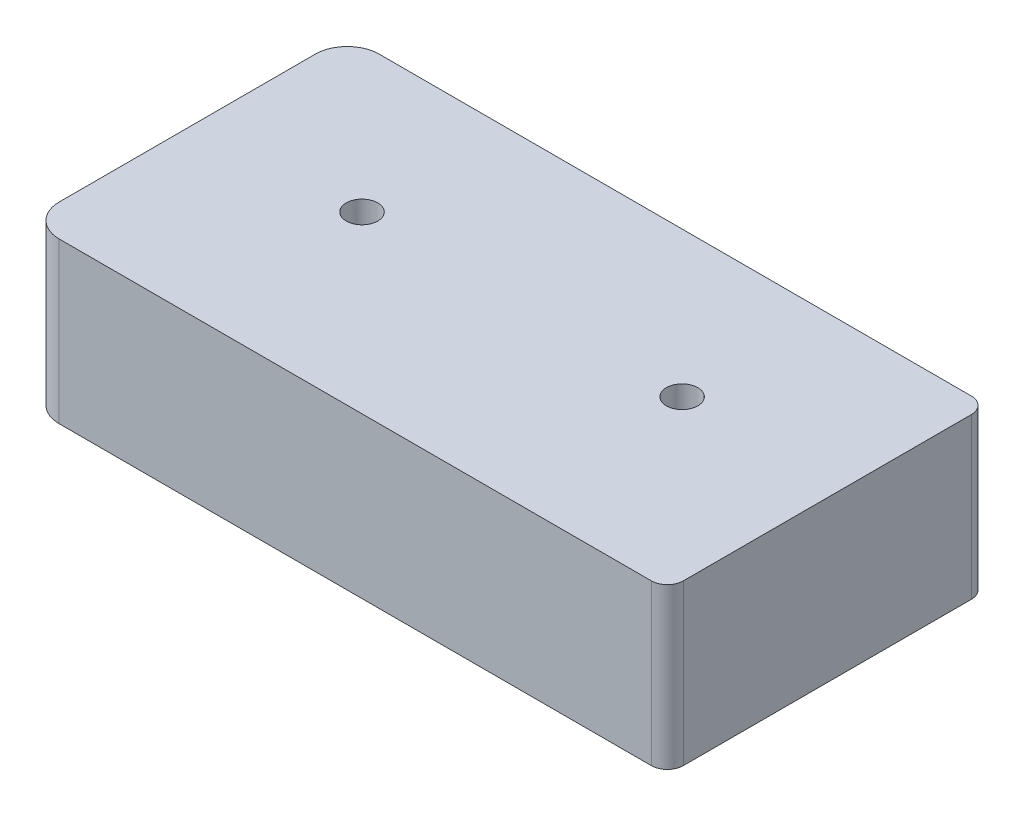
ISO-10303-21;
HEADER;
FILE_DESCRIPTION(('STEP AP214'),'2;1');
FILE_NAME('part.step','',(''),(''),'','','');
FILE_SCHEMA(('AUTOMOTIVE_DESIGN { 1 0 10303 214 1 1 1 1 }'));
ENDSEC;
DATA;
#1=APPLICATION_CONTEXT('core data for automotive mechanical design processes');
#2=APPLICATION_PROTOCOL_DEFINITION('international standard','automotive_design',2000,#1);
#3=PRODUCT_CONTEXT('',#1,'mechanical');
#4=PRODUCT('Part','Part','',(#3));
#5=PRODUCT_RELATED_PRODUCT_CATEGORY('part','',(#4));
#6=PRODUCT_DEFINITION_FORMATION('','',#4);
#7=PRODUCT_DEFINITION_CONTEXT('part definition',#1,'design');
#8=PRODUCT_DEFINITION('design','',#6,#7);
#9=PRODUCT_DEFINITION_SHAPE('','',#8);
#10=(LENGTH_UNIT() NAMED_UNIT(*) SI_UNIT(.MILLI.,.METRE.));
#11=(NAMED_UNIT(*) PLANE_ANGLE_UNIT() SI_UNIT($,.RADIAN.));
#12=(NAMED_UNIT(*) SI_UNIT($,.STERADIAN.) SOLID_ANGLE_UNIT());
#13=UNCERTAINTY_MEASURE_WITH_UNIT(LENGTH_MEASURE(1.E-05),#10,'distance_accuracy_value','');
#14=(GEOMETRIC_REPRESENTATION_CONTEXT(3) GLOBAL_UNCERTAINTY_ASSIGNED_CONTEXT((#13)) GLOBAL_UNIT_ASSIGNED_CONTEXT((#10,
#11,#12)) REPRESENTATION_CONTEXT('',''));
#15=CARTESIAN_POINT('',(0.,0.,0.));
#16=DIRECTION('',(0.,0.,1.));
#17=DIRECTION('',(1.,0.,0.));
#18=AXIS2_PLACEMENT_3D('',#15,#16,#17);
#19=CARTESIAN_POINT('',(-50.8,25.4,-23.0572815533981));
#20=DIRECTION('',(1.,0.,0.));
#21=DIRECTION('',(0.,0.,-1.));
#22=AXIS2_PLACEMENT_3D('',#19,#20,#21);
#23=PLANE('',#22);
#24=DIRECTION('',(0.,0.,1.));
#25=VECTOR('',#24,1.);
#26=CARTESIAN_POINT('',(-50.8,0.,-23.0572815533981));
#27=LINE('',#26,#25);
#28=CARTESIAN_POINT('',(-50.8,0.,-17.9772815533981));
#29=VERTEX_POINT('',#28);
#30=CARTESIAN_POINT('',(-50.8,0.,22.6627184466019));
#31=VERTEX_POINT('',#30);
#32=EDGE_CURVE('E138',#29,#31,#27,.T.);
#33=ORIENTED_EDGE('',*,*,#32,.T.);
#34=DIRECTION('',(0.,-1.,0.));
#35=VECTOR('',#34,1.);
#36=CARTESIAN_POINT('',(-50.8,25.4,22.6627184466019));
#37=LINE('',#36,#35);
#38=CARTESIAN_POINT('',(-50.8,25.4,22.6627184466019));
#39=VERTEX_POINT('',#38);
#40=EDGE_CURVE('E121',#31,#39,#37,.F.);
#41=ORIENTED_EDGE('',*,*,#40,.T.);
#42=DIRECTION('',(0.,0.,1.));
#43=VECTOR('',#42,1.);
#44=CARTESIAN_POINT('',(-50.8,25.4,-23.0572815533981));
#45=LINE('',#44,#43);
#46=CARTESIAN_POINT('',(-50.8,25.4,-17.9772815533981));
#47=VERTEX_POINT('',#46);
#48=EDGE_CURVE('E147',#47,#39,#45,.T.);
#49=ORIENTED_EDGE('',*,*,#48,.F.);
#50=DIRECTION('',(0.,-1.,0.));
#51=VECTOR('',#50,1.);
#52=CARTESIAN_POINT('',(-50.8,25.4,-17.9772815533981));
#53=LINE('',#52,#51);
#54=EDGE_CURVE('E126',#47,#29,#53,.T.);
#55=ORIENTED_EDGE('',*,*,#54,.T.);
#56=EDGE_LOOP('',(#33,#41,#49,#55));
#57=FACE_BOUND('',#56,.T.);
#58=ADVANCED_FACE('F48',(#57),#23,.F.);
#59=CARTESIAN_POINT('',(-50.8,25.4,27.7427184466019));
#60=DIRECTION('',(0.,0.,-1.));
#61=DIRECTION('',(-1.,0.,0.));
#62=AXIS2_PLACEMENT_3D('',#59,#60,#61);
#63=PLANE('',#62);
#64=DIRECTION('',(1.,0.,0.));
#65=VECTOR('',#64,1.);
#66=CARTESIAN_POINT('',(-50.8,0.,27.7427184466019));
#67=LINE('',#66,#65);
#68=CARTESIAN_POINT('',(-45.72,0.,27.7427184466019));
#69=VERTEX_POINT('',#68);
#70=CARTESIAN_POINT('',(48.26,0.,27.7427184466019));
#71=VERTEX_POINT('',#70);
#72=EDGE_CURVE('E130',#69,#71,#67,.T.);
#73=ORIENTED_EDGE('',*,*,#72,.T.);
#74=DIRECTION('',(0.,-1.,0.));
#75=VECTOR('',#74,1.);
#76=CARTESIAN_POINT('',(48.26,25.4,27.7427184466019));
#77=LINE('',#76,#75);
#78=CARTESIAN_POINT('',(48.26,25.4,27.7427184466019));
#79=VERTEX_POINT('',#78);
#80=EDGE_CURVE('E71',#71,#79,#77,.F.);
#81=ORIENTED_EDGE('',*,*,#80,.T.);
#82=DIRECTION('',(1.,0.,0.));
#83=VECTOR('',#82,1.);
#84=CARTESIAN_POINT('',(-50.8,25.4,27.7427184466019));
#85=LINE('',#84,#83);
#86=CARTESIAN_POINT('',(-45.72,25.4,27.7427184466019));
#87=VERTEX_POINT('',#86);
#88=EDGE_CURVE('E131',#87,#79,#85,.T.);
#89=ORIENTED_EDGE('',*,*,#88,.F.);
#90=DIRECTION('',(0.,-1.,0.));
#91=VECTOR('',#90,1.);
#92=CARTESIAN_POINT('',(-45.72,25.4,27.7427184466019));
#93=LINE('',#92,#91);
#94=EDGE_CURVE('E120',#87,#69,#93,.T.);
#95=ORIENTED_EDGE('',*,*,#94,.T.);
#96=EDGE_LOOP('',(#73,#81,#89,#95));
#97=FACE_BOUND('',#96,.T.);
#98=ADVANCED_FACE('F129',(#97),#63,.F.);
#99=CARTESIAN_POINT('',(50.8,25.4,-23.0572815533981));
#100=DIRECTION('',(-1.,0.,0.));
#101=DIRECTION('',(0.,0.,1.));
#102=AXIS2_PLACEMENT_3D('',#99,#100,#101);
#103=PLANE('',#102);
#104=DIRECTION('',(0.,0.,-1.));
#105=VECTOR('',#104,1.);
#106=CARTESIAN_POINT('',(50.8,25.4,-23.0572815533981));
#107=LINE('',#106,#105);
#108=CARTESIAN_POINT('',(50.8,25.4,25.2027184466019));
#109=VERTEX_POINT('',#108);
#110=CARTESIAN_POINT('',(50.8,25.4,-20.5172815533981));
#111=VERTEX_POINT('',#110);
#112=EDGE_CURVE('E173',#109,#111,#107,.T.);
#113=ORIENTED_EDGE('',*,*,#112,.F.);
#114=DIRECTION('',(0.,-1.,0.));
#115=VECTOR('',#114,1.);
#116=CARTESIAN_POINT('',(50.8,25.4,25.2027184466019));
#117=LINE('',#116,#115);
#118=CARTESIAN_POINT('',(50.8,0.,25.2027184466019));
#119=VERTEX_POINT('',#118);
#120=EDGE_CURVE('E163',#109,#119,#117,.T.);
#121=ORIENTED_EDGE('',*,*,#120,.T.);
#122=DIRECTION('',(0.,0.,-1.));
#123=VECTOR('',#122,1.);
#124=CARTESIAN_POINT('',(50.8,0.,-23.0572815533981));
#125=LINE('',#124,#123);
#126=CARTESIAN_POINT('',(50.8,0.,-20.5172815533981));
#127=VERTEX_POINT('',#126);
#128=EDGE_CURVE('E137',#119,#127,#125,.T.);
#129=ORIENTED_EDGE('',*,*,#128,.T.);
#130=DIRECTION('',(0.,-1.,0.));
#131=VECTOR('',#130,1.);
#132=CARTESIAN_POINT('',(50.8,25.4,-20.5172815533981));
#133=LINE('',#132,#131);
#134=EDGE_CURVE('E161',#127,#111,#133,.F.);
#135=ORIENTED_EDGE('',*,*,#134,.T.);
#136=EDGE_LOOP('',(#113,#121,#129,#135));
#137=FACE_BOUND('',#136,.T.);
#138=ADVANCED_FACE('F177',(#137),#103,.F.);
#139=CARTESIAN_POINT('',(-50.8,25.4,-23.0572815533981));
#140=DIRECTION('',(0.,0.,1.));
#141=DIRECTION('',(1.,0.,0.));
#142=AXIS2_PLACEMENT_3D('',#139,#140,#141);
#143=PLANE('',#142);
#144=DIRECTION('',(-1.,0.,0.));
#145=VECTOR('',#144,1.);
#146=CARTESIAN_POINT('',(-50.8,25.4,-23.0572815533981));
#147=LINE('',#146,#145);
#148=CARTESIAN_POINT('',(48.26,25.4,-23.0572815533981));
#149=VERTEX_POINT('',#148);
#150=CARTESIAN_POINT('',(-45.72,25.4,-23.0572815533981));
#151=VERTEX_POINT('',#150);
#152=EDGE_CURVE('E132',#149,#151,#147,.T.);
#153=ORIENTED_EDGE('',*,*,#152,.F.);
#154=DIRECTION('',(0.,-1.,0.));
#155=VECTOR('',#154,1.);
#156=CARTESIAN_POINT('',(48.26,25.4,-23.0572815533981));
#157=LINE('',#156,#155);
#158=CARTESIAN_POINT('',(48.26,0.,-23.0572815533981));
#159=VERTEX_POINT('',#158);
#160=EDGE_CURVE('E13',#149,#159,#157,.T.);
#161=ORIENTED_EDGE('',*,*,#160,.T.);
#162=DIRECTION('',(-1.,0.,0.));
#163=VECTOR('',#162,1.);
#164=CARTESIAN_POINT('',(-50.8,0.,-23.0572815533981));
#165=LINE('',#164,#163);
#166=CARTESIAN_POINT('',(-45.72,0.,-23.0572815533981));
#167=VERTEX_POINT('',#166);
#168=EDGE_CURVE('E141',#159,#167,#165,.T.);
#169=ORIENTED_EDGE('',*,*,#168,.T.);
#170=DIRECTION('',(0.,-1.,0.));
#171=VECTOR('',#170,1.);
#172=CARTESIAN_POINT('',(-45.72,25.4,-23.0572815533981));
#173=LINE('',#172,#171);
#174=EDGE_CURVE('E158',#167,#151,#173,.F.);
#175=ORIENTED_EDGE('',*,*,#174,.T.);
#176=EDGE_LOOP('',(#153,#161,#169,#175));
#177=FACE_BOUND('',#176,.T.);
#178=ADVANCED_FACE('F209',(#177),#143,.F.);
#179=CARTESIAN_POINT('',(0.,25.4,0.));
#180=DIRECTION('',(0.,1.,0.));
#181=DIRECTION('',(0.,0.,1.));
#182=AXIS2_PLACEMENT_3D('',#179,#180,#181);
#183=PLANE('',#182);
#184=CARTESIAN_POINT('',(-25.4,25.4,0.));
#185=DIRECTION('',(0.,1.,0.));
#186=DIRECTION('',(0.,0.,1.));
#187=AXIS2_PLACEMENT_3D('',#184,#185,#186);
#188=CIRCLE('',#187,2.5);
#189=CARTESIAN_POINT('',(-25.4,25.4,2.5));
#190=VERTEX_POINT('',#189);
#191=EDGE_CURVE('E265',#190,#190,#188,.T.);
#192=ORIENTED_EDGE('',*,*,#191,.F.);
#193=EDGE_LOOP('',(#192));
#194=FACE_BOUND('',#193,.T.);
#195=CARTESIAN_POINT('',(25.4,25.4,0.));
#196=DIRECTION('',(0.,1.,0.));
#197=DIRECTION('',(0.,0.,1.));
#198=AXIS2_PLACEMENT_3D('',#195,#196,#197);
#199=CIRCLE('',#198,2.5);
#200=CARTESIAN_POINT('',(25.4,25.4,2.5));
#201=VERTEX_POINT('',#200);
#202=EDGE_CURVE('E270',#201,#201,#199,.T.);
#203=ORIENTED_EDGE('',*,*,#202,.F.);
#204=EDGE_LOOP('',(#203));
#205=FACE_BOUND('',#204,.T.);
#206=ORIENTED_EDGE('',*,*,#88,.T.);
#207=CARTESIAN_POINT('',(48.26,25.4,25.2027184466019));
#208=DIRECTION('',(0.,1.,0.));
#209=DIRECTION('',(0.,0.,1.));
#210=AXIS2_PLACEMENT_3D('',#207,#208,#209);
#211=CIRCLE('',#210,2.54);
#212=EDGE_CURVE('E56',#79,#109,#211,.T.);
#213=ORIENTED_EDGE('',*,*,#212,.T.);
#214=ORIENTED_EDGE('',*,*,#112,.T.);
#215=CARTESIAN_POINT('',(48.26,25.4,-20.5172815533981));
#216=DIRECTION('',(0.,1.,0.));
#217=DIRECTION('',(0.,0.,1.));
#218=AXIS2_PLACEMENT_3D('',#215,#216,#217);
#219=CIRCLE('',#218,2.54);
#220=EDGE_CURVE('E63',#111,#149,#219,.T.);
#221=ORIENTED_EDGE('',*,*,#220,.T.);
#222=ORIENTED_EDGE('',*,*,#152,.T.);
#223=CARTESIAN_POINT('',(-45.72,25.4,-17.9772815533981));
#224=DIRECTION('',(0.,1.,0.));
#225=DIRECTION('',(0.,0.,1.));
#226=AXIS2_PLACEMENT_3D('',#223,#224,#225);
#227=CIRCLE('',#226,5.08);
#228=EDGE_CURVE('E154',#151,#47,#227,.T.);
#229=ORIENTED_EDGE('',*,*,#228,.T.);
#230=ORIENTED_EDGE('',*,*,#48,.T.);
#231=CARTESIAN_POINT('',(-45.72,25.4,22.6627184466019));
#232=DIRECTION('',(0.,1.,0.));
#233=DIRECTION('',(0.,0.,1.));
#234=AXIS2_PLACEMENT_3D('',#231,#232,#233);
#235=CIRCLE('',#234,5.08);
#236=EDGE_CURVE('E156',#39,#87,#235,.T.);
#237=ORIENTED_EDGE('',*,*,#236,.T.);
#238=EDGE_LOOP('',(#206,#213,#214,#221,#222,#229,#230,#237));
#239=FACE_BOUND('',#238,.T.);
#240=ADVANCED_FACE('F172',(#194,#205,#239),#183,.T.);
#241=CARTESIAN_POINT('',(0.,0.,0.));
#242=DIRECTION('',(0.,1.,0.));
#243=DIRECTION('',(0.,0.,1.));
#244=AXIS2_PLACEMENT_3D('',#241,#242,#243);
#245=PLANE('',#244);
#246=CARTESIAN_POINT('',(-25.4,0.,0.));
#247=DIRECTION('',(0.,1.,0.));
#248=DIRECTION('',(0.,0.,1.));
#249=AXIS2_PLACEMENT_3D('',#246,#247,#248);
#250=CIRCLE('',#249,2.5);
#251=CARTESIAN_POINT('',(-25.4,0.,2.5));
#252=VERTEX_POINT('',#251);
#253=EDGE_CURVE('E143',#252,#252,#250,.T.);
#254=ORIENTED_EDGE('',*,*,#253,.T.);
#255=EDGE_LOOP('',(#254));
#256=FACE_BOUND('',#255,.T.);
#257=CARTESIAN_POINT('',(25.4,0.,0.));
#258=DIRECTION('',(0.,1.,0.));
#259=DIRECTION('',(0.,0.,1.));
#260=AXIS2_PLACEMENT_3D('',#257,#258,#259);
#261=CIRCLE('',#260,2.5);
#262=CARTESIAN_POINT('',(25.4,0.,2.5));
#263=VERTEX_POINT('',#262);
#264=EDGE_CURVE('E266',#263,#263,#261,.T.);
#265=ORIENTED_EDGE('',*,*,#264,.T.);
#266=EDGE_LOOP('',(#265));
#267=FACE_BOUND('',#266,.T.);
#268=ORIENTED_EDGE('',*,*,#128,.F.);
#269=CARTESIAN_POINT('',(48.26,0.,25.2027184466019));
#270=DIRECTION('',(0.,1.,0.));
#271=DIRECTION('',(0.,0.,1.));
#272=AXIS2_PLACEMENT_3D('',#269,#270,#271);
#273=CIRCLE('',#272,2.54);
#274=EDGE_CURVE('E136',#119,#71,#273,.F.);
#275=ORIENTED_EDGE('',*,*,#274,.T.);
#276=ORIENTED_EDGE('',*,*,#72,.F.);
#277=CARTESIAN_POINT('',(-45.72,0.,22.6627184466019));
#278=DIRECTION('',(0.,1.,0.));
#279=DIRECTION('',(0.,0.,1.));
#280=AXIS2_PLACEMENT_3D('',#277,#278,#279);
#281=CIRCLE('',#280,5.08);
#282=EDGE_CURVE('E116',#69,#31,#281,.F.);
#283=ORIENTED_EDGE('',*,*,#282,.T.);
#284=ORIENTED_EDGE('',*,*,#32,.F.);
#285=CARTESIAN_POINT('',(-45.72,0.,-17.9772815533981));
#286=DIRECTION('',(0.,1.,0.));
#287=DIRECTION('',(0.,0.,1.));
#288=AXIS2_PLACEMENT_3D('',#285,#286,#287);
#289=CIRCLE('',#288,5.08);
#290=EDGE_CURVE('E127',#29,#167,#289,.F.);
#291=ORIENTED_EDGE('',*,*,#290,.T.);
#292=ORIENTED_EDGE('',*,*,#168,.F.);
#293=CARTESIAN_POINT('',(48.26,0.,-20.5172815533981));
#294=DIRECTION('',(0.,1.,0.));
#295=DIRECTION('',(0.,0.,1.));
#296=AXIS2_PLACEMENT_3D('',#293,#294,#295);
#297=CIRCLE('',#296,2.54);
#298=EDGE_CURVE('E166',#159,#127,#297,.F.);
#299=ORIENTED_EDGE('',*,*,#298,.T.);
#300=EDGE_LOOP('',(#268,#275,#276,#283,#284,#291,#292,#299));
#301=FACE_BOUND('',#300,.T.);
#302=ADVANCED_FACE('F135',(#256,#267,#301),#245,.F.);
#303=CARTESIAN_POINT('',(-45.72,25.4,22.6627184466019));
#304=DIRECTION('',(0.,-1.,0.));
#305=DIRECTION('',(0.,0.,-1.));
#306=AXIS2_PLACEMENT_3D('',#303,#304,#305);
#307=CYLINDRICAL_SURFACE('',#306,5.08);
#308=ORIENTED_EDGE('',*,*,#236,.F.);
#309=ORIENTED_EDGE('',*,*,#40,.F.);
#310=ORIENTED_EDGE('',*,*,#282,.F.);
#311=ORIENTED_EDGE('',*,*,#94,.F.);
#312=EDGE_LOOP('',(#308,#309,#310,#311));
#313=FACE_BOUND('',#312,.T.);
#314=ADVANCED_FACE('F119',(#313),#307,.T.);
#315=CARTESIAN_POINT('',(-45.72,25.4,-17.9772815533981));
#316=DIRECTION('',(0.,-1.,0.));
#317=DIRECTION('',(0.,0.,-1.));
#318=AXIS2_PLACEMENT_3D('',#315,#316,#317);
#319=CYLINDRICAL_SURFACE('',#318,5.08);
#320=ORIENTED_EDGE('',*,*,#228,.F.);
#321=ORIENTED_EDGE('',*,*,#174,.F.);
#322=ORIENTED_EDGE('',*,*,#290,.F.);
#323=ORIENTED_EDGE('',*,*,#54,.F.);
#324=EDGE_LOOP('',(#320,#321,#322,#323));
#325=FACE_BOUND('',#324,.T.);
#326=ADVANCED_FACE('F182',(#325),#319,.T.);
#327=CARTESIAN_POINT('',(48.26,25.4,25.2027184466019));
#328=DIRECTION('',(0.,-1.,0.));
#329=DIRECTION('',(0.,0.,-1.));
#330=AXIS2_PLACEMENT_3D('',#327,#328,#329);
#331=CYLINDRICAL_SURFACE('',#330,2.54);
#332=ORIENTED_EDGE('',*,*,#212,.F.);
#333=ORIENTED_EDGE('',*,*,#80,.F.);
#334=ORIENTED_EDGE('',*,*,#274,.F.);
#335=ORIENTED_EDGE('',*,*,#120,.F.);
#336=EDGE_LOOP('',(#332,#333,#334,#335));
#337=FACE_BOUND('',#336,.T.);
#338=ADVANCED_FACE('F180',(#337),#331,.T.);
#339=CARTESIAN_POINT('',(48.26,25.4,-20.5172815533981));
#340=DIRECTION('',(0.,-1.,0.));
#341=DIRECTION('',(0.,0.,-1.));
#342=AXIS2_PLACEMENT_3D('',#339,#340,#341);
#343=CYLINDRICAL_SURFACE('',#342,2.54);
#344=ORIENTED_EDGE('',*,*,#220,.F.);
#345=ORIENTED_EDGE('',*,*,#134,.F.);
#346=ORIENTED_EDGE('',*,*,#298,.F.);
#347=ORIENTED_EDGE('',*,*,#160,.F.);
#348=EDGE_LOOP('',(#344,#345,#346,#347));
#349=FACE_BOUND('',#348,.T.);
#350=ADVANCED_FACE('F50',(#349),#343,.T.);
#351=CARTESIAN_POINT('',(25.4,0.,0.));
#352=DIRECTION('',(0.,1.,0.));
#353=DIRECTION('',(0.,0.,1.));
#354=AXIS2_PLACEMENT_3D('',#351,#352,#353);
#355=CYLINDRICAL_SURFACE('',#354,2.5);
#356=ORIENTED_EDGE('',*,*,#264,.F.);
#357=EDGE_LOOP('',(#356));
#358=FACE_BOUND('',#357,.T.);
#359=ORIENTED_EDGE('',*,*,#202,.T.);
#360=EDGE_LOOP('',(#359));
#361=FACE_BOUND('',#360,.T.);
#362=ADVANCED_FACE('F187',(#358,#361),#355,.F.);
#363=CARTESIAN_POINT('',(-25.4,0.,0.));
#364=DIRECTION('',(0.,1.,0.));
#365=DIRECTION('',(0.,0.,1.));
#366=AXIS2_PLACEMENT_3D('',#363,#364,#365);
#367=CYLINDRICAL_SURFACE('',#366,2.5);
#368=ORIENTED_EDGE('',*,*,#253,.F.);
#369=EDGE_LOOP('',(#368));
#370=FACE_BOUND('',#369,.T.);
#371=ORIENTED_EDGE('',*,*,#191,.T.);
#372=EDGE_LOOP('',(#371));
#373=FACE_BOUND('',#372,.T.);
#374=ADVANCED_FACE('F248',(#370,#373),#367,.F.);
#375=CLOSED_SHELL('',(#58,#98,#138,#178,#240,#302,#314,#326,#338,#350,#362,#374));
#376=MANIFOLD_SOLID_BREP('B2',#375);
#377=ADVANCED_BREP_SHAPE_REPRESENTATION('',(#18,#376),#14);
#378=SHAPE_DEFINITION_REPRESENTATION(#9,#377);
ENDSEC;
END-ISO-10303-21;
